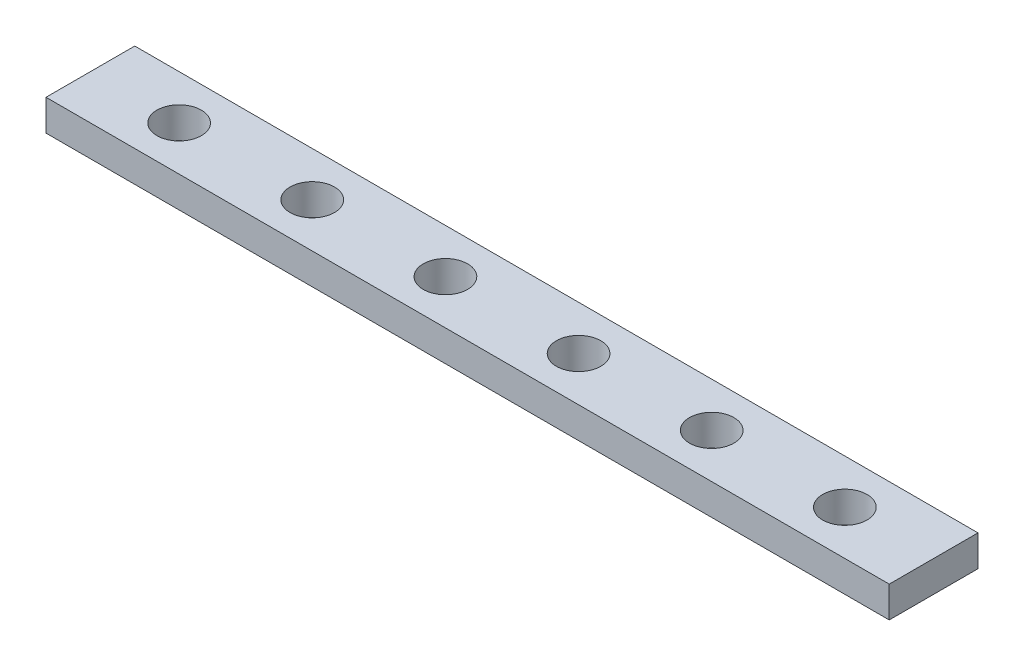
ISO-10303-21;
HEADER;
FILE_DESCRIPTION(('STEP AP214'),'2;1');
FILE_NAME('part.step','',(''),(''),'','','');
FILE_SCHEMA(('AUTOMOTIVE_DESIGN { 1 0 10303 214 1 1 1 1 }'));
ENDSEC;
DATA;
#1=APPLICATION_CONTEXT('core data for automotive mechanical design processes');
#2=APPLICATION_PROTOCOL_DEFINITION('international standard','automotive_design',2000,#1);
#3=PRODUCT_CONTEXT('',#1,'mechanical');
#4=PRODUCT('Part','Part','',(#3));
#5=PRODUCT_RELATED_PRODUCT_CATEGORY('part','',(#4));
#6=PRODUCT_DEFINITION_FORMATION('','',#4);
#7=PRODUCT_DEFINITION_CONTEXT('part definition',#1,'design');
#8=PRODUCT_DEFINITION('design','',#6,#7);
#9=PRODUCT_DEFINITION_SHAPE('','',#8);
#10=(LENGTH_UNIT() NAMED_UNIT(*) SI_UNIT(.MILLI.,.METRE.));
#11=(NAMED_UNIT(*) PLANE_ANGLE_UNIT() SI_UNIT($,.RADIAN.));
#12=(NAMED_UNIT(*) SI_UNIT($,.STERADIAN.) SOLID_ANGLE_UNIT());
#13=UNCERTAINTY_MEASURE_WITH_UNIT(LENGTH_MEASURE(1.E-05),#10,'distance_accuracy_value','');
#14=(GEOMETRIC_REPRESENTATION_CONTEXT(3) GLOBAL_UNCERTAINTY_ASSIGNED_CONTEXT((#13)) GLOBAL_UNIT_ASSIGNED_CONTEXT((#10,
#11,#12)) REPRESENTATION_CONTEXT('',''));
#15=CARTESIAN_POINT('',(0.,0.,0.));
#16=DIRECTION('',(0.,0.,1.));
#17=DIRECTION('',(1.,0.,0.));
#18=AXIS2_PLACEMENT_3D('',#15,#16,#17);
#19=CARTESIAN_POINT('',(0.,0.,0.));
#20=DIRECTION('',(0.,-1.,0.));
#21=DIRECTION('',(0.,0.,-1.));
#22=AXIS2_PLACEMENT_3D('',#19,#20,#21);
#23=PLANE('',#22);
#24=CARTESIAN_POINT('',(10.,0.,-5.));
#25=DIRECTION('',(0.,1.,0.));
#26=DIRECTION('',(0.,0.,1.));
#27=AXIS2_PLACEMENT_3D('',#24,#25,#26);
#28=CIRCLE('',#27,2.49999999999999);
#29=CARTESIAN_POINT('',(10.,0.,-2.50000000000001));
#30=VERTEX_POINT('',#29);
#31=EDGE_CURVE('E108',#30,#30,#28,.T.);
#32=ORIENTED_EDGE('',*,*,#31,.T.);
#33=EDGE_LOOP('',(#32));
#34=FACE_BOUND('',#33,.T.);
#35=CARTESIAN_POINT('',(40.,0.,-5.));
#36=DIRECTION('',(0.,1.,0.));
#37=DIRECTION('',(0.,0.,1.));
#38=AXIS2_PLACEMENT_3D('',#35,#36,#37);
#39=CIRCLE('',#38,2.49999999999999);
#40=CARTESIAN_POINT('',(40.,0.,-2.50000000000001));
#41=VERTEX_POINT('',#40);
#42=EDGE_CURVE('E119',#41,#41,#39,.T.);
#43=ORIENTED_EDGE('',*,*,#42,.T.);
#44=EDGE_LOOP('',(#43));
#45=FACE_BOUND('',#44,.T.);
#46=CARTESIAN_POINT('',(70.,0.,-5.00000000000001));
#47=DIRECTION('',(0.,1.,0.));
#48=DIRECTION('',(0.,0.,1.));
#49=AXIS2_PLACEMENT_3D('',#46,#47,#48);
#50=CIRCLE('',#49,2.49999999999999);
#51=CARTESIAN_POINT('',(70.,0.,-2.50000000000001));
#52=VERTEX_POINT('',#51);
#53=EDGE_CURVE('E100',#52,#52,#50,.T.);
#54=ORIENTED_EDGE('',*,*,#53,.T.);
#55=EDGE_LOOP('',(#54));
#56=FACE_BOUND('',#55,.T.);
#57=CARTESIAN_POINT('',(85.,0.,-5.));
#58=DIRECTION('',(0.,1.,0.));
#59=DIRECTION('',(0.,0.,1.));
#60=AXIS2_PLACEMENT_3D('',#57,#58,#59);
#61=CIRCLE('',#60,2.49999999999999);
#62=CARTESIAN_POINT('',(85.,0.,-2.5));
#63=VERTEX_POINT('',#62);
#64=EDGE_CURVE('E95',#63,#63,#61,.T.);
#65=ORIENTED_EDGE('',*,*,#64,.T.);
#66=EDGE_LOOP('',(#65));
#67=FACE_BOUND('',#66,.T.);
#68=CARTESIAN_POINT('',(55.,0.,-5.));
#69=DIRECTION('',(0.,1.,0.));
#70=DIRECTION('',(0.,0.,1.));
#71=AXIS2_PLACEMENT_3D('',#68,#69,#70);
#72=CIRCLE('',#71,2.49999999999999);
#73=CARTESIAN_POINT('',(55.,0.,-2.50000000000001));
#74=VERTEX_POINT('',#73);
#75=EDGE_CURVE('E122',#74,#74,#72,.T.);
#76=ORIENTED_EDGE('',*,*,#75,.T.);
#77=EDGE_LOOP('',(#76));
#78=FACE_BOUND('',#77,.T.);
#79=CARTESIAN_POINT('',(25.,0.,-5.));
#80=DIRECTION('',(0.,1.,0.));
#81=DIRECTION('',(0.,0.,1.));
#82=AXIS2_PLACEMENT_3D('',#79,#80,#81);
#83=CIRCLE('',#82,2.49999999999999);
#84=CARTESIAN_POINT('',(25.,0.,-2.50000000000001));
#85=VERTEX_POINT('',#84);
#86=EDGE_CURVE('E116',#85,#85,#83,.T.);
#87=ORIENTED_EDGE('',*,*,#86,.T.);
#88=EDGE_LOOP('',(#87));
#89=FACE_BOUND('',#88,.T.);
#90=DIRECTION('',(-1.,0.,0.));
#91=VECTOR('',#90,1.);
#92=CARTESIAN_POINT('',(0.,0.,-10.));
#93=LINE('',#92,#91);
#94=CARTESIAN_POINT('',(95.,0.,-10.));
#95=VERTEX_POINT('',#94);
#96=CARTESIAN_POINT('',(0.,0.,-10.));
#97=VERTEX_POINT('',#96);
#98=EDGE_CURVE('E97',#95,#97,#93,.T.);
#99=ORIENTED_EDGE('',*,*,#98,.F.);
#100=DIRECTION('',(0.,0.,-1.));
#101=VECTOR('',#100,1.);
#102=CARTESIAN_POINT('',(95.,0.,0.));
#103=LINE('',#102,#101);
#104=CARTESIAN_POINT('',(95.,0.,0.));
#105=VERTEX_POINT('',#104);
#106=EDGE_CURVE('E56',#105,#95,#103,.T.);
#107=ORIENTED_EDGE('',*,*,#106,.F.);
#108=DIRECTION('',(1.,0.,0.));
#109=VECTOR('',#108,1.);
#110=CARTESIAN_POINT('',(0.,0.,0.));
#111=LINE('',#110,#109);
#112=CARTESIAN_POINT('',(0.,0.,0.));
#113=VERTEX_POINT('',#112);
#114=EDGE_CURVE('E94',#113,#105,#111,.T.);
#115=ORIENTED_EDGE('',*,*,#114,.F.);
#116=DIRECTION('',(0.,0.,1.));
#117=VECTOR('',#116,1.);
#118=CARTESIAN_POINT('',(0.,0.,0.));
#119=LINE('',#118,#117);
#120=EDGE_CURVE('E90',#97,#113,#119,.T.);
#121=ORIENTED_EDGE('',*,*,#120,.F.);
#122=EDGE_LOOP('',(#99,#107,#115,#121));
#123=FACE_BOUND('',#122,.T.);
#124=ADVANCED_FACE('F33',(#34,#45,#56,#67,#78,#89,#123),#23,.T.);
#125=CARTESIAN_POINT('',(0.,6.,0.));
#126=DIRECTION('',(0.,0.,-1.));
#127=DIRECTION('',(-1.,0.,0.));
#128=AXIS2_PLACEMENT_3D('',#125,#126,#127);
#129=PLANE('',#128);
#130=DIRECTION('',(0.,-1.,0.));
#131=VECTOR('',#130,1.);
#132=CARTESIAN_POINT('',(95.,6.,0.));
#133=LINE('',#132,#131);
#134=CARTESIAN_POINT('',(95.,3.5,0.));
#135=VERTEX_POINT('',#134);
#136=EDGE_CURVE('E85',#135,#105,#133,.T.);
#137=ORIENTED_EDGE('',*,*,#136,.F.);
#138=DIRECTION('',(1.,0.,0.));
#139=VECTOR('',#138,1.);
#140=CARTESIAN_POINT('',(95.,3.5,0.));
#141=LINE('',#140,#139);
#142=CARTESIAN_POINT('',(0.,3.5,0.));
#143=VERTEX_POINT('',#142);
#144=EDGE_CURVE('E48',#143,#135,#141,.T.);
#145=ORIENTED_EDGE('',*,*,#144,.F.);
#146=DIRECTION('',(0.,-1.,0.));
#147=VECTOR('',#146,1.);
#148=CARTESIAN_POINT('',(0.,6.,0.));
#149=LINE('',#148,#147);
#150=EDGE_CURVE('E11',#143,#113,#149,.T.);
#151=ORIENTED_EDGE('',*,*,#150,.T.);
#152=ORIENTED_EDGE('',*,*,#114,.T.);
#153=EDGE_LOOP('',(#137,#145,#151,#152));
#154=FACE_BOUND('',#153,.T.);
#155=ADVANCED_FACE('F82',(#154),#129,.F.);
#156=CARTESIAN_POINT('',(0.,6.,-10.));
#157=DIRECTION('',(0.,0.,1.));
#158=DIRECTION('',(1.,0.,0.));
#159=AXIS2_PLACEMENT_3D('',#156,#157,#158);
#160=PLANE('',#159);
#161=DIRECTION('',(0.,-1.,0.));
#162=VECTOR('',#161,1.);
#163=CARTESIAN_POINT('',(0.,6.,-10.));
#164=LINE('',#163,#162);
#165=CARTESIAN_POINT('',(0.,3.5,-10.));
#166=VERTEX_POINT('',#165);
#167=EDGE_CURVE('E41',#166,#97,#164,.T.);
#168=ORIENTED_EDGE('',*,*,#167,.F.);
#169=DIRECTION('',(-1.,0.,0.));
#170=VECTOR('',#169,1.);
#171=CARTESIAN_POINT('',(0.,3.5,-10.));
#172=LINE('',#171,#170);
#173=CARTESIAN_POINT('',(95.,3.5,-10.));
#174=VERTEX_POINT('',#173);
#175=EDGE_CURVE('E75',#174,#166,#172,.T.);
#176=ORIENTED_EDGE('',*,*,#175,.F.);
#177=DIRECTION('',(0.,1.,0.));
#178=VECTOR('',#177,1.);
#179=CARTESIAN_POINT('',(95.,0.,-10.));
#180=LINE('',#179,#178);
#181=EDGE_CURVE('E106',#95,#174,#180,.T.);
#182=ORIENTED_EDGE('',*,*,#181,.F.);
#183=ORIENTED_EDGE('',*,*,#98,.T.);
#184=EDGE_LOOP('',(#168,#176,#182,#183));
#185=FACE_BOUND('',#184,.T.);
#186=ADVANCED_FACE('F105',(#185),#160,.F.);
#187=CARTESIAN_POINT('',(0.,6.,0.));
#188=DIRECTION('',(1.,0.,0.));
#189=DIRECTION('',(0.,0.,-1.));
#190=AXIS2_PLACEMENT_3D('',#187,#188,#189);
#191=PLANE('',#190);
#192=ORIENTED_EDGE('',*,*,#150,.F.);
#193=DIRECTION('',(0.,0.,1.));
#194=VECTOR('',#193,1.);
#195=CARTESIAN_POINT('',(0.,3.5,0.));
#196=LINE('',#195,#194);
#197=EDGE_CURVE('E72',#166,#143,#196,.T.);
#198=ORIENTED_EDGE('',*,*,#197,.F.);
#199=ORIENTED_EDGE('',*,*,#167,.T.);
#200=ORIENTED_EDGE('',*,*,#120,.T.);
#201=EDGE_LOOP('',(#192,#198,#199,#200));
#202=FACE_BOUND('',#201,.T.);
#203=ADVANCED_FACE('F35',(#202),#191,.F.);
#204=CARTESIAN_POINT('',(85.,6.,-5.));
#205=DIRECTION('',(0.,-1.,0.));
#206=DIRECTION('',(0.,0.,-1.));
#207=AXIS2_PLACEMENT_3D('',#204,#205,#206);
#208=CYLINDRICAL_SURFACE('',#207,2.49999999999999);
#209=CARTESIAN_POINT('',(85.,3.5,-5.));
#210=DIRECTION('',(0.,-1.,0.));
#211=DIRECTION('',(0.,0.,-1.));
#212=AXIS2_PLACEMENT_3D('',#209,#210,#211);
#213=CIRCLE('',#212,2.49999999999999);
#214=CARTESIAN_POINT('',(85.,3.5,-7.49999999999999));
#215=VERTEX_POINT('',#214);
#216=EDGE_CURVE('E110',#215,#215,#213,.T.);
#217=ORIENTED_EDGE('',*,*,#216,.F.);
#218=EDGE_LOOP('',(#217));
#219=FACE_BOUND('',#218,.T.);
#220=ORIENTED_EDGE('',*,*,#64,.F.);
#221=EDGE_LOOP('',(#220));
#222=FACE_BOUND('',#221,.T.);
#223=ADVANCED_FACE('F132',(#219,#222),#208,.F.);
#224=CARTESIAN_POINT('',(70.,6.,-5.00000000000001));
#225=DIRECTION('',(0.,-1.,0.));
#226=DIRECTION('',(0.,0.,-1.));
#227=AXIS2_PLACEMENT_3D('',#224,#225,#226);
#228=CYLINDRICAL_SURFACE('',#227,2.49999999999999);
#229=CARTESIAN_POINT('',(70.,3.5,-5.00000000000001));
#230=DIRECTION('',(0.,-1.,0.));
#231=DIRECTION('',(0.,0.,-1.));
#232=AXIS2_PLACEMENT_3D('',#229,#230,#231);
#233=CIRCLE('',#232,2.49999999999999);
#234=CARTESIAN_POINT('',(70.,3.5,-7.5));
#235=VERTEX_POINT('',#234);
#236=EDGE_CURVE('E231',#235,#235,#233,.T.);
#237=ORIENTED_EDGE('',*,*,#236,.F.);
#238=EDGE_LOOP('',(#237));
#239=FACE_BOUND('',#238,.T.);
#240=ORIENTED_EDGE('',*,*,#53,.F.);
#241=EDGE_LOOP('',(#240));
#242=FACE_BOUND('',#241,.T.);
#243=ADVANCED_FACE('F129',(#239,#242),#228,.F.);
#244=CARTESIAN_POINT('',(55.,6.,-5.));
#245=DIRECTION('',(0.,-1.,0.));
#246=DIRECTION('',(0.,0.,-1.));
#247=AXIS2_PLACEMENT_3D('',#244,#245,#246);
#248=CYLINDRICAL_SURFACE('',#247,2.49999999999999);
#249=CARTESIAN_POINT('',(55.,3.5,-5.));
#250=DIRECTION('',(0.,-1.,0.));
#251=DIRECTION('',(0.,0.,-1.));
#252=AXIS2_PLACEMENT_3D('',#249,#250,#251);
#253=CIRCLE('',#252,2.49999999999999);
#254=CARTESIAN_POINT('',(55.,3.5,-7.5));
#255=VERTEX_POINT('',#254);
#256=EDGE_CURVE('E235',#255,#255,#253,.T.);
#257=ORIENTED_EDGE('',*,*,#256,.F.);
#258=EDGE_LOOP('',(#257));
#259=FACE_BOUND('',#258,.T.);
#260=ORIENTED_EDGE('',*,*,#75,.F.);
#261=EDGE_LOOP('',(#260));
#262=FACE_BOUND('',#261,.T.);
#263=ADVANCED_FACE('F131',(#259,#262),#248,.F.);
#264=CARTESIAN_POINT('',(40.,6.,-5.));
#265=DIRECTION('',(0.,-1.,0.));
#266=DIRECTION('',(0.,0.,-1.));
#267=AXIS2_PLACEMENT_3D('',#264,#265,#266);
#268=CYLINDRICAL_SURFACE('',#267,2.49999999999999);
#269=CARTESIAN_POINT('',(40.,3.5,-5.));
#270=DIRECTION('',(0.,-1.,0.));
#271=DIRECTION('',(0.,0.,-1.));
#272=AXIS2_PLACEMENT_3D('',#269,#270,#271);
#273=CIRCLE('',#272,2.49999999999999);
#274=CARTESIAN_POINT('',(40.,3.5,-7.49999999999999));
#275=VERTEX_POINT('',#274);
#276=EDGE_CURVE('E239',#275,#275,#273,.T.);
#277=ORIENTED_EDGE('',*,*,#276,.F.);
#278=EDGE_LOOP('',(#277));
#279=FACE_BOUND('',#278,.T.);
#280=ORIENTED_EDGE('',*,*,#42,.F.);
#281=EDGE_LOOP('',(#280));
#282=FACE_BOUND('',#281,.T.);
#283=ADVANCED_FACE('F139',(#279,#282),#268,.F.);
#284=CARTESIAN_POINT('',(25.,6.,-5.));
#285=DIRECTION('',(0.,-1.,0.));
#286=DIRECTION('',(0.,0.,-1.));
#287=AXIS2_PLACEMENT_3D('',#284,#285,#286);
#288=CYLINDRICAL_SURFACE('',#287,2.49999999999999);
#289=CARTESIAN_POINT('',(25.,3.5,-5.));
#290=DIRECTION('',(0.,-1.,0.));
#291=DIRECTION('',(0.,0.,-1.));
#292=AXIS2_PLACEMENT_3D('',#289,#290,#291);
#293=CIRCLE('',#292,2.49999999999999);
#294=CARTESIAN_POINT('',(25.,3.5,-7.49999999999999));
#295=VERTEX_POINT('',#294);
#296=EDGE_CURVE('E243',#295,#295,#293,.T.);
#297=ORIENTED_EDGE('',*,*,#296,.F.);
#298=EDGE_LOOP('',(#297));
#299=FACE_BOUND('',#298,.T.);
#300=ORIENTED_EDGE('',*,*,#86,.F.);
#301=EDGE_LOOP('',(#300));
#302=FACE_BOUND('',#301,.T.);
#303=ADVANCED_FACE('F182',(#299,#302),#288,.F.);
#304=CARTESIAN_POINT('',(10.,6.,-5.));
#305=DIRECTION('',(0.,-1.,0.));
#306=DIRECTION('',(0.,0.,-1.));
#307=AXIS2_PLACEMENT_3D('',#304,#305,#306);
#308=CYLINDRICAL_SURFACE('',#307,2.49999999999999);
#309=CARTESIAN_POINT('',(10.,3.5,-5.));
#310=DIRECTION('',(0.,-1.,0.));
#311=DIRECTION('',(0.,0.,-1.));
#312=AXIS2_PLACEMENT_3D('',#309,#310,#311);
#313=CIRCLE('',#312,2.49999999999999);
#314=CARTESIAN_POINT('',(10.,3.5,-7.49999999999999));
#315=VERTEX_POINT('',#314);
#316=EDGE_CURVE('E246',#315,#315,#313,.T.);
#317=ORIENTED_EDGE('',*,*,#316,.F.);
#318=EDGE_LOOP('',(#317));
#319=FACE_BOUND('',#318,.T.);
#320=ORIENTED_EDGE('',*,*,#31,.F.);
#321=EDGE_LOOP('',(#320));
#322=FACE_BOUND('',#321,.T.);
#323=ADVANCED_FACE('F192',(#319,#322),#308,.F.);
#324=CARTESIAN_POINT('',(95.,0.,0.));
#325=DIRECTION('',(1.,0.,0.));
#326=DIRECTION('',(0.,0.,-1.));
#327=AXIS2_PLACEMENT_3D('',#324,#325,#326);
#328=PLANE('',#327);
#329=DIRECTION('',(0.,0.,-1.));
#330=VECTOR('',#329,1.);
#331=CARTESIAN_POINT('',(95.,3.5,-10.));
#332=LINE('',#331,#330);
#333=EDGE_CURVE('E86',#135,#174,#332,.T.);
#334=ORIENTED_EDGE('',*,*,#333,.F.);
#335=ORIENTED_EDGE('',*,*,#136,.T.);
#336=ORIENTED_EDGE('',*,*,#106,.T.);
#337=ORIENTED_EDGE('',*,*,#181,.T.);
#338=EDGE_LOOP('',(#334,#335,#336,#337));
#339=FACE_BOUND('',#338,.T.);
#340=ADVANCED_FACE('F202',(#339),#328,.T.);
#341=CARTESIAN_POINT('',(0.,3.5,0.));
#342=DIRECTION('',(0.,-1.,0.));
#343=DIRECTION('',(0.,0.,-1.));
#344=AXIS2_PLACEMENT_3D('',#341,#342,#343);
#345=PLANE('',#344);
#346=ORIENTED_EDGE('',*,*,#216,.T.);
#347=EDGE_LOOP('',(#346));
#348=FACE_BOUND('',#347,.T.);
#349=ORIENTED_EDGE('',*,*,#236,.T.);
#350=EDGE_LOOP('',(#349));
#351=FACE_BOUND('',#350,.T.);
#352=ORIENTED_EDGE('',*,*,#256,.T.);
#353=EDGE_LOOP('',(#352));
#354=FACE_BOUND('',#353,.T.);
#355=ORIENTED_EDGE('',*,*,#276,.T.);
#356=EDGE_LOOP('',(#355));
#357=FACE_BOUND('',#356,.T.);
#358=ORIENTED_EDGE('',*,*,#296,.T.);
#359=EDGE_LOOP('',(#358));
#360=FACE_BOUND('',#359,.T.);
#361=ORIENTED_EDGE('',*,*,#316,.T.);
#362=EDGE_LOOP('',(#361));
#363=FACE_BOUND('',#362,.T.);
#364=ORIENTED_EDGE('',*,*,#197,.T.);
#365=ORIENTED_EDGE('',*,*,#144,.T.);
#366=ORIENTED_EDGE('',*,*,#333,.T.);
#367=ORIENTED_EDGE('',*,*,#175,.T.);
#368=EDGE_LOOP('',(#364,#365,#366,#367));
#369=FACE_BOUND('',#368,.T.);
#370=ADVANCED_FACE('F73',(#348,#351,#354,#357,#360,#363,#369),#345,.F.);
#371=CLOSED_SHELL('',(#124,#155,#186,#203,#223,#243,#263,#283,#303,#323,#340,#370));
#372=MANIFOLD_SOLID_BREP('B2',#371);
#373=ADVANCED_BREP_SHAPE_REPRESENTATION('',(#18,#372),#14);
#374=SHAPE_DEFINITION_REPRESENTATION(#9,#373);
ENDSEC;
END-ISO-10303-21;
